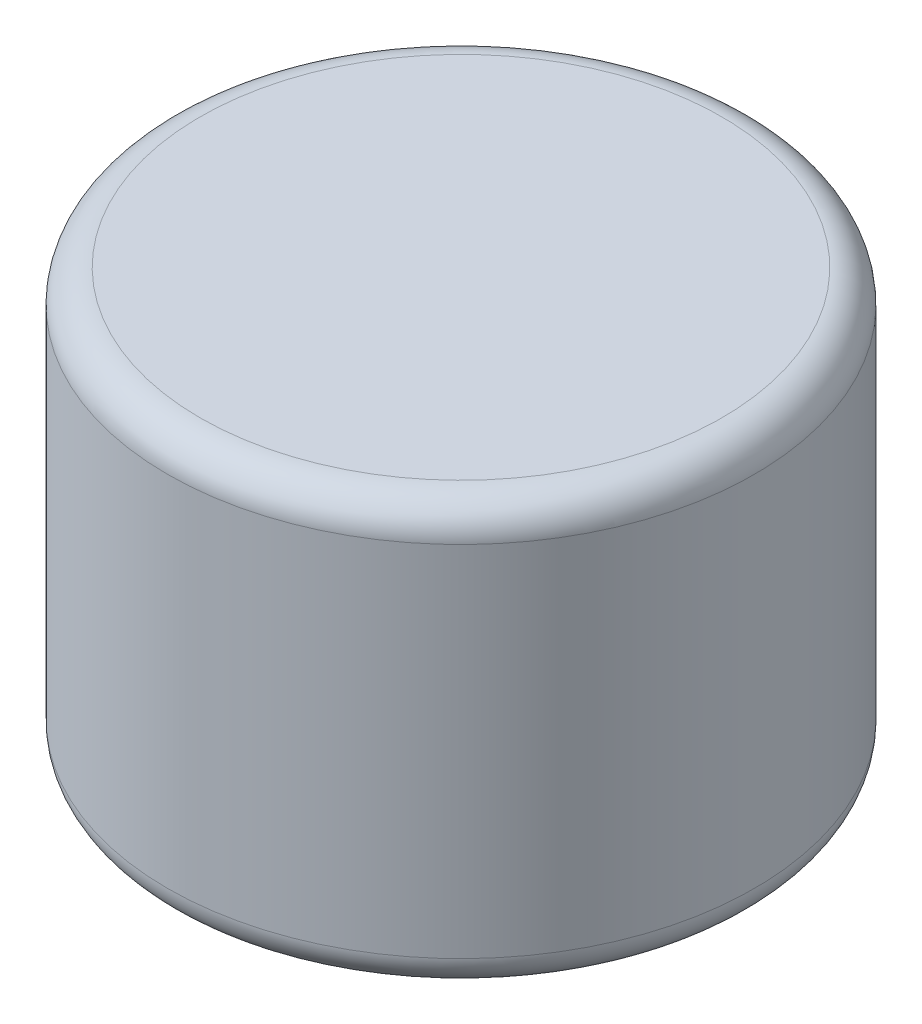
ISO-10303-21;
HEADER;
FILE_DESCRIPTION(('STEP AP214'),'2;1');
FILE_NAME('part.step','',(''),(''),'','','');
FILE_SCHEMA(('AUTOMOTIVE_DESIGN { 1 0 10303 214 1 1 1 1 }'));
ENDSEC;
DATA;
#1=APPLICATION_CONTEXT('core data for automotive mechanical design processes');
#2=APPLICATION_PROTOCOL_DEFINITION('international standard','automotive_design',2000,#1);
#3=PRODUCT_CONTEXT('',#1,'mechanical');
#4=PRODUCT('Part','Part','',(#3));
#5=PRODUCT_RELATED_PRODUCT_CATEGORY('part','',(#4));
#6=PRODUCT_DEFINITION_FORMATION('','',#4);
#7=PRODUCT_DEFINITION_CONTEXT('part definition',#1,'design');
#8=PRODUCT_DEFINITION('design','',#6,#7);
#9=PRODUCT_DEFINITION_SHAPE('','',#8);
#10=(LENGTH_UNIT() NAMED_UNIT(*) SI_UNIT(.MILLI.,.METRE.));
#11=(NAMED_UNIT(*) PLANE_ANGLE_UNIT() SI_UNIT($,.RADIAN.));
#12=(NAMED_UNIT(*) SI_UNIT($,.STERADIAN.) SOLID_ANGLE_UNIT());
#13=UNCERTAINTY_MEASURE_WITH_UNIT(LENGTH_MEASURE(1.E-05),#10,'distance_accuracy_value','');
#14=(GEOMETRIC_REPRESENTATION_CONTEXT(3) GLOBAL_UNCERTAINTY_ASSIGNED_CONTEXT((#13)) GLOBAL_UNIT_ASSIGNED_CONTEXT((#10,
#11,#12)) REPRESENTATION_CONTEXT('',''));
#15=CARTESIAN_POINT('',(0.,0.,0.));
#16=DIRECTION('',(0.,0.,1.));
#17=DIRECTION('',(1.,0.,0.));
#18=AXIS2_PLACEMENT_3D('',#15,#16,#17);
#19=CARTESIAN_POINT('',(0.,7.,0.4));
#20=DIRECTION('',(0.,0.,1.));
#21=DIRECTION('',(1.,0.,0.));
#22=AXIS2_PLACEMENT_3D('',#19,#20,#21);
#23=PLANE('',#22);
#24=DIRECTION('',(-1.,0.,0.));
#25=VECTOR('',#24,1.);
#26=CARTESIAN_POINT('',(0.,0.,0.4));
#27=LINE('',#26,#25);
#28=CARTESIAN_POINT('',(3.02365672654817,0.,0.4));
#29=VERTEX_POINT('',#28);
#30=CARTESIAN_POINT('',(-3.02365672654817,0.,0.4));
#31=VERTEX_POINT('',#30);
#32=EDGE_CURVE('E85',#29,#31,#27,.T.);
#33=ORIENTED_EDGE('',*,*,#32,.F.);
#34=DIRECTION('',(0.,-1.,0.));
#35=VECTOR('',#34,1.);
#36=CARTESIAN_POINT('',(3.02365672654817,7.,0.4));
#37=LINE('',#36,#35);
#38=CARTESIAN_POINT('',(3.02365672654817,7.,0.4));
#39=VERTEX_POINT('',#38);
#40=EDGE_CURVE('E77',#39,#29,#37,.T.);
#41=ORIENTED_EDGE('',*,*,#40,.F.);
#42=DIRECTION('',(-1.,0.,0.));
#43=VECTOR('',#42,1.);
#44=CARTESIAN_POINT('',(0.,7.,0.4));
#45=LINE('',#44,#43);
#46=CARTESIAN_POINT('',(-3.02365672654817,7.,0.4));
#47=VERTEX_POINT('',#46);
#48=EDGE_CURVE('E56',#39,#47,#45,.T.);
#49=ORIENTED_EDGE('',*,*,#48,.T.);
#50=DIRECTION('',(0.,-1.,0.));
#51=VECTOR('',#50,1.);
#52=CARTESIAN_POINT('',(-3.02365672654817,7.,0.4));
#53=LINE('',#52,#51);
#54=EDGE_CURVE('E84',#47,#31,#53,.T.);
#55=ORIENTED_EDGE('',*,*,#54,.T.);
#56=EDGE_LOOP('',(#33,#41,#49,#55));
#57=FACE_BOUND('',#56,.T.);
#58=ADVANCED_FACE('F43',(#57),#23,.T.);
#59=CARTESIAN_POINT('',(0.,7.,0.));
#60=DIRECTION('',(0.,-1.,0.));
#61=DIRECTION('',(0.,0.,-1.));
#62=AXIS2_PLACEMENT_3D('',#59,#60,#61);
#63=CYLINDRICAL_SURFACE('',#62,3.05);
#64=CARTESIAN_POINT('',(0.,0.,0.));
#65=DIRECTION('',(0.,1.,0.));
#66=DIRECTION('',(0.,0.,1.));
#67=AXIS2_PLACEMENT_3D('',#64,#65,#66);
#68=CIRCLE('',#67,3.05);
#69=CARTESIAN_POINT('',(3.02365672654817,0.,-0.4));
#70=VERTEX_POINT('',#69);
#71=CARTESIAN_POINT('',(-3.02365672654817,0.,-0.4));
#72=VERTEX_POINT('',#71);
#73=EDGE_CURVE('E97',#70,#72,#68,.T.);
#74=ORIENTED_EDGE('',*,*,#73,.F.);
#75=DIRECTION('',(0.,-1.,0.));
#76=VECTOR('',#75,1.);
#77=CARTESIAN_POINT('',(3.02365672654817,7.,-0.4));
#78=LINE('',#77,#76);
#79=CARTESIAN_POINT('',(3.02365672654817,7.,-0.4));
#80=VERTEX_POINT('',#79);
#81=EDGE_CURVE('E86',#80,#70,#78,.T.);
#82=ORIENTED_EDGE('',*,*,#81,.F.);
#83=CARTESIAN_POINT('',(0.,7.,0.));
#84=DIRECTION('',(0.,1.,0.));
#85=DIRECTION('',(0.,0.,1.));
#86=AXIS2_PLACEMENT_3D('',#83,#84,#85);
#87=CIRCLE('',#86,3.05);
#88=CARTESIAN_POINT('',(-3.02365672654817,7.,-0.4));
#89=VERTEX_POINT('',#88);
#90=EDGE_CURVE('E100',#80,#89,#87,.T.);
#91=ORIENTED_EDGE('',*,*,#90,.T.);
#92=DIRECTION('',(0.,-1.,0.));
#93=VECTOR('',#92,1.);
#94=CARTESIAN_POINT('',(-3.02365672654817,7.,-0.4));
#95=LINE('',#94,#93);
#96=EDGE_CURVE('E118',#89,#72,#95,.T.);
#97=ORIENTED_EDGE('',*,*,#96,.T.);
#98=EDGE_LOOP('',(#74,#82,#91,#97));
#99=FACE_BOUND('',#98,.T.);
#100=ADVANCED_FACE('F171',(#99),#63,.F.);
#101=EDGE_CURVE('E91',#31,#29,#68,.T.);
#102=ORIENTED_EDGE('',*,*,#101,.F.);
#103=ORIENTED_EDGE('',*,*,#54,.F.);
#104=EDGE_CURVE('E120',#47,#39,#87,.T.);
#105=ORIENTED_EDGE('',*,*,#104,.T.);
#106=ORIENTED_EDGE('',*,*,#40,.T.);
#107=EDGE_LOOP('',(#102,#103,#105,#106));
#108=FACE_BOUND('',#107,.T.);
#109=ADVANCED_FACE('F93',(#108),#63,.F.);
#110=CARTESIAN_POINT('',(0.,7.,-0.4));
#111=DIRECTION('',(0.,0.,-1.));
#112=DIRECTION('',(-1.,0.,0.));
#113=AXIS2_PLACEMENT_3D('',#110,#111,#112);
#114=PLANE('',#113);
#115=DIRECTION('',(1.,0.,0.));
#116=VECTOR('',#115,1.);
#117=CARTESIAN_POINT('',(0.,0.,-0.4));
#118=LINE('',#117,#116);
#119=EDGE_CURVE('E95',#72,#70,#118,.T.);
#120=ORIENTED_EDGE('',*,*,#119,.F.);
#121=ORIENTED_EDGE('',*,*,#96,.F.);
#122=DIRECTION('',(1.,0.,0.));
#123=VECTOR('',#122,1.);
#124=CARTESIAN_POINT('',(0.,7.,-0.4));
#125=LINE('',#124,#123);
#126=EDGE_CURVE('E116',#89,#80,#125,.T.);
#127=ORIENTED_EDGE('',*,*,#126,.T.);
#128=ORIENTED_EDGE('',*,*,#81,.T.);
#129=EDGE_LOOP('',(#120,#121,#127,#128));
#130=FACE_BOUND('',#129,.T.);
#131=ADVANCED_FACE('F179',(#130),#114,.T.);
#132=CARTESIAN_POINT('',(0.,7.,0.));
#133=DIRECTION('',(0.,-1.,0.));
#134=DIRECTION('',(0.,0.,-1.));
#135=AXIS2_PLACEMENT_3D('',#132,#133,#134);
#136=CYLINDRICAL_SURFACE('',#135,3.5);
#137=CARTESIAN_POINT('',(0.,6.,0.));
#138=DIRECTION('',(0.,1.,0.));
#139=DIRECTION('',(0.,0.,1.));
#140=AXIS2_PLACEMENT_3D('',#137,#138,#139);
#141=CIRCLE('',#140,3.5);
#142=CARTESIAN_POINT('',(0.,6.,3.5));
#143=VERTEX_POINT('',#142);
#144=EDGE_CURVE('E132',#143,#143,#141,.F.);
#145=ORIENTED_EDGE('',*,*,#144,.T.);
#146=EDGE_LOOP('',(#145));
#147=FACE_BOUND('',#146,.T.);
#148=CARTESIAN_POINT('',(0.,0.,0.));
#149=DIRECTION('',(0.,1.,0.));
#150=DIRECTION('',(0.,0.,1.));
#151=AXIS2_PLACEMENT_3D('',#148,#149,#150);
#152=CIRCLE('',#151,3.5);
#153=CARTESIAN_POINT('',(0.,0.,3.5));
#154=VERTEX_POINT('',#153);
#155=EDGE_CURVE('E94',#154,#154,#152,.T.);
#156=ORIENTED_EDGE('',*,*,#155,.T.);
#157=EDGE_LOOP('',(#156));
#158=FACE_BOUND('',#157,.T.);
#159=ADVANCED_FACE('F182',(#147,#158),#136,.T.);
#160=CARTESIAN_POINT('',(0.,0.,0.));
#161=DIRECTION('',(0.,1.,0.));
#162=DIRECTION('',(0.,0.,1.));
#163=AXIS2_PLACEMENT_3D('',#160,#161,#162);
#164=PLANE('',#163);
#165=ORIENTED_EDGE('',*,*,#73,.T.);
#166=ORIENTED_EDGE('',*,*,#119,.T.);
#167=EDGE_LOOP('',(#165,#166));
#168=FACE_BOUND('',#167,.T.);
#169=ORIENTED_EDGE('',*,*,#32,.T.);
#170=ORIENTED_EDGE('',*,*,#101,.T.);
#171=EDGE_LOOP('',(#169,#170));
#172=FACE_BOUND('',#171,.T.);
#173=ORIENTED_EDGE('',*,*,#155,.F.);
#174=EDGE_LOOP('',(#173));
#175=FACE_BOUND('',#174,.T.);
#176=ADVANCED_FACE('F88',(#168,#172,#175),#164,.F.);
#177=CARTESIAN_POINT('',(0.,7.,0.));
#178=DIRECTION('',(0.,1.,0.));
#179=DIRECTION('',(0.,0.,1.));
#180=AXIS2_PLACEMENT_3D('',#177,#178,#179);
#181=PLANE('',#180);
#182=CARTESIAN_POINT('',(0.,7.,0.));
#183=DIRECTION('',(0.,1.,0.));
#184=DIRECTION('',(0.,0.,1.));
#185=AXIS2_PLACEMENT_3D('',#182,#183,#184);
#186=CIRCLE('',#185,4.5);
#187=CARTESIAN_POINT('',(0.,7.,4.5));
#188=VERTEX_POINT('',#187);
#189=EDGE_CURVE('E128',#188,#188,#186,.T.);
#190=ORIENTED_EDGE('',*,*,#189,.T.);
#191=EDGE_LOOP('',(#190));
#192=FACE_BOUND('',#191,.T.);
#193=CARTESIAN_POINT('',(0.,7.,0.));
#194=DIRECTION('',(0.,1.,0.));
#195=DIRECTION('',(0.,0.,1.));
#196=AXIS2_PLACEMENT_3D('',#193,#194,#195);
#197=CIRCLE('',#196,6.);
#198=CARTESIAN_POINT('',(0.,7.,6.));
#199=VERTEX_POINT('',#198);
#200=EDGE_CURVE('E129',#199,#199,#197,.F.);
#201=ORIENTED_EDGE('',*,*,#200,.T.);
#202=EDGE_LOOP('',(#201));
#203=FACE_BOUND('',#202,.T.);
#204=ADVANCED_FACE('F197',(#192,#203),#181,.F.);
#205=ORIENTED_EDGE('',*,*,#48,.F.);
#206=ORIENTED_EDGE('',*,*,#104,.F.);
#207=EDGE_LOOP('',(#205,#206));
#208=FACE_BOUND('',#207,.T.);
#209=ADVANCED_FACE('F198',(#208),#181,.F.);
#210=ORIENTED_EDGE('',*,*,#90,.F.);
#211=ORIENTED_EDGE('',*,*,#126,.F.);
#212=EDGE_LOOP('',(#210,#211));
#213=FACE_BOUND('',#212,.T.);
#214=ADVANCED_FACE('F170',(#213),#181,.F.);
#215=CARTESIAN_POINT('',(0.,-2.,0.));
#216=DIRECTION('',(0.,1.,0.));
#217=DIRECTION('',(0.,0.,1.));
#218=AXIS2_PLACEMENT_3D('',#215,#216,#217);
#219=CYLINDRICAL_SURFACE('',#218,7.);
#220=CARTESIAN_POINT('',(0.,6.,0.));
#221=DIRECTION('',(0.,1.,0.));
#222=DIRECTION('',(0.,0.,1.));
#223=AXIS2_PLACEMENT_3D('',#220,#221,#222);
#224=CIRCLE('',#223,7.);
#225=CARTESIAN_POINT('',(0.,6.,7.));
#226=VERTEX_POINT('',#225);
#227=EDGE_CURVE('E135',#226,#226,#224,.T.);
#228=ORIENTED_EDGE('',*,*,#227,.T.);
#229=EDGE_LOOP('',(#228));
#230=FACE_BOUND('',#229,.T.);
#231=CARTESIAN_POINT('',(0.,-2.,0.));
#232=DIRECTION('',(0.,-1.,0.));
#233=DIRECTION('',(0.,0.,-1.));
#234=AXIS2_PLACEMENT_3D('',#231,#232,#233);
#235=CIRCLE('',#234,7.);
#236=CARTESIAN_POINT('',(0.,-2.,-7.));
#237=VERTEX_POINT('',#236);
#238=EDGE_CURVE('E104',#237,#237,#235,.T.);
#239=ORIENTED_EDGE('',*,*,#238,.T.);
#240=EDGE_LOOP('',(#239));
#241=FACE_BOUND('',#240,.T.);
#242=ADVANCED_FACE('F158',(#230,#241),#219,.F.);
#243=CARTESIAN_POINT('',(0.,-2.,0.));
#244=DIRECTION('',(0.,-1.,0.));
#245=DIRECTION('',(0.,0.,-1.));
#246=AXIS2_PLACEMENT_3D('',#243,#244,#245);
#247=PLANE('',#246);
#248=CARTESIAN_POINT('',(0.,-2.,0.));
#249=DIRECTION('',(0.,-1.,0.));
#250=DIRECTION('',(0.,0.,-1.));
#251=AXIS2_PLACEMENT_3D('',#248,#249,#250);
#252=CIRCLE('',#251,8.);
#253=CARTESIAN_POINT('',(0.,-2.,-8.));
#254=VERTEX_POINT('',#253);
#255=EDGE_CURVE('E137',#254,#254,#252,.T.);
#256=ORIENTED_EDGE('',*,*,#255,.T.);
#257=EDGE_LOOP('',(#256));
#258=FACE_BOUND('',#257,.T.);
#259=ORIENTED_EDGE('',*,*,#238,.F.);
#260=EDGE_LOOP('',(#259));
#261=FACE_BOUND('',#260,.T.);
#262=ADVANCED_FACE('F155',(#258,#261),#247,.T.);
#263=CARTESIAN_POINT('',(0.,11.,0.));
#264=DIRECTION('',(0.,1.,0.));
#265=DIRECTION('',(0.,0.,1.));
#266=AXIS2_PLACEMENT_3D('',#263,#264,#265);
#267=PLANE('',#266);
#268=CARTESIAN_POINT('',(0.,11.,0.));
#269=DIRECTION('',(0.,1.,0.));
#270=DIRECTION('',(0.,0.,1.));
#271=AXIS2_PLACEMENT_3D('',#268,#269,#270);
#272=CIRCLE('',#271,8.);
#273=CARTESIAN_POINT('',(0.,11.,8.));
#274=VERTEX_POINT('',#273);
#275=EDGE_CURVE('E11',#274,#274,#272,.T.);
#276=ORIENTED_EDGE('',*,*,#275,.T.);
#277=EDGE_LOOP('',(#276));
#278=FACE_BOUND('',#277,.T.);
#279=ADVANCED_FACE('F157',(#278),#267,.T.);
#280=CARTESIAN_POINT('',(0.,11.,0.));
#281=DIRECTION('',(0.,-1.,0.));
#282=DIRECTION('',(0.,0.,-1.));
#283=AXIS2_PLACEMENT_3D('',#280,#281,#282);
#284=CYLINDRICAL_SURFACE('',#283,9.);
#285=CARTESIAN_POINT('',(0.,-0.999999999999999,0.));
#286=DIRECTION('',(0.,-1.,0.));
#287=DIRECTION('',(0.,0.,-1.));
#288=AXIS2_PLACEMENT_3D('',#285,#286,#287);
#289=CIRCLE('',#288,9.);
#290=CARTESIAN_POINT('',(0.,-0.999999999999999,-9.));
#291=VERTEX_POINT('',#290);
#292=EDGE_CURVE('E55',#291,#291,#289,.F.);
#293=ORIENTED_EDGE('',*,*,#292,.T.);
#294=EDGE_LOOP('',(#293));
#295=FACE_BOUND('',#294,.T.);
#296=CARTESIAN_POINT('',(0.,10.,0.));
#297=DIRECTION('',(0.,1.,0.));
#298=DIRECTION('',(0.,0.,1.));
#299=AXIS2_PLACEMENT_3D('',#296,#297,#298);
#300=CIRCLE('',#299,9.);
#301=CARTESIAN_POINT('',(0.,10.,9.));
#302=VERTEX_POINT('',#301);
#303=EDGE_CURVE('E142',#302,#302,#300,.F.);
#304=ORIENTED_EDGE('',*,*,#303,.T.);
#305=EDGE_LOOP('',(#304));
#306=FACE_BOUND('',#305,.T.);
#307=ADVANCED_FACE('F149',(#295,#306),#284,.T.);
#308=CARTESIAN_POINT('',(0.,6.,0.));
#309=DIRECTION('',(0.,1.,0.));
#310=DIRECTION('',(0.,0.,1.));
#311=AXIS2_PLACEMENT_3D('',#308,#309,#310);
#312=TOROIDAL_SURFACE('',#311,4.5,1.);
#313=ORIENTED_EDGE('',*,*,#144,.F.);
#314=EDGE_LOOP('',(#313));
#315=FACE_BOUND('',#314,.T.);
#316=ORIENTED_EDGE('',*,*,#189,.F.);
#317=EDGE_LOOP('',(#316));
#318=FACE_BOUND('',#317,.T.);
#319=ADVANCED_FACE('F184',(#315,#318),#312,.F.);
#320=CARTESIAN_POINT('',(0.,6.,0.));
#321=DIRECTION('',(0.,1.,0.));
#322=DIRECTION('',(0.,0.,1.));
#323=AXIS2_PLACEMENT_3D('',#320,#321,#322);
#324=TOROIDAL_SURFACE('',#323,6.,1.);
#325=ORIENTED_EDGE('',*,*,#227,.F.);
#326=EDGE_LOOP('',(#325));
#327=FACE_BOUND('',#326,.T.);
#328=ORIENTED_EDGE('',*,*,#200,.F.);
#329=EDGE_LOOP('',(#328));
#330=FACE_BOUND('',#329,.T.);
#331=ADVANCED_FACE('F152',(#327,#330),#324,.F.);
#332=CARTESIAN_POINT('',(0.,-0.999999999999999,0.));
#333=DIRECTION('',(0.,-1.,0.));
#334=DIRECTION('',(0.,0.,-1.));
#335=AXIS2_PLACEMENT_3D('',#332,#333,#334);
#336=TOROIDAL_SURFACE('',#335,8.,1.);
#337=ORIENTED_EDGE('',*,*,#292,.F.);
#338=EDGE_LOOP('',(#337));
#339=FACE_BOUND('',#338,.T.);
#340=ORIENTED_EDGE('',*,*,#255,.F.);
#341=EDGE_LOOP('',(#340));
#342=FACE_BOUND('',#341,.T.);
#343=ADVANCED_FACE('F148',(#339,#342),#336,.T.);
#344=CARTESIAN_POINT('',(0.,10.,0.));
#345=DIRECTION('',(0.,1.,0.));
#346=DIRECTION('',(0.,0.,1.));
#347=AXIS2_PLACEMENT_3D('',#344,#345,#346);
#348=TOROIDAL_SURFACE('',#347,8.,1.);
#349=ORIENTED_EDGE('',*,*,#303,.F.);
#350=EDGE_LOOP('',(#349));
#351=FACE_BOUND('',#350,.T.);
#352=ORIENTED_EDGE('',*,*,#275,.F.);
#353=EDGE_LOOP('',(#352));
#354=FACE_BOUND('',#353,.T.);
#355=ADVANCED_FACE('F44',(#351,#354),#348,.T.);
#356=CLOSED_SHELL('',(#58,#100,#109,#131,#159,#176,#204,#209,#214,#242,#262,#279,#307,#319,#331,
#343,#355));
#357=MANIFOLD_SOLID_BREP('B2',#356);
#358=ADVANCED_BREP_SHAPE_REPRESENTATION('',(#18,#357),#14);
#359=SHAPE_DEFINITION_REPRESENTATION(#9,#358);
ENDSEC;
END-ISO-10303-21;
